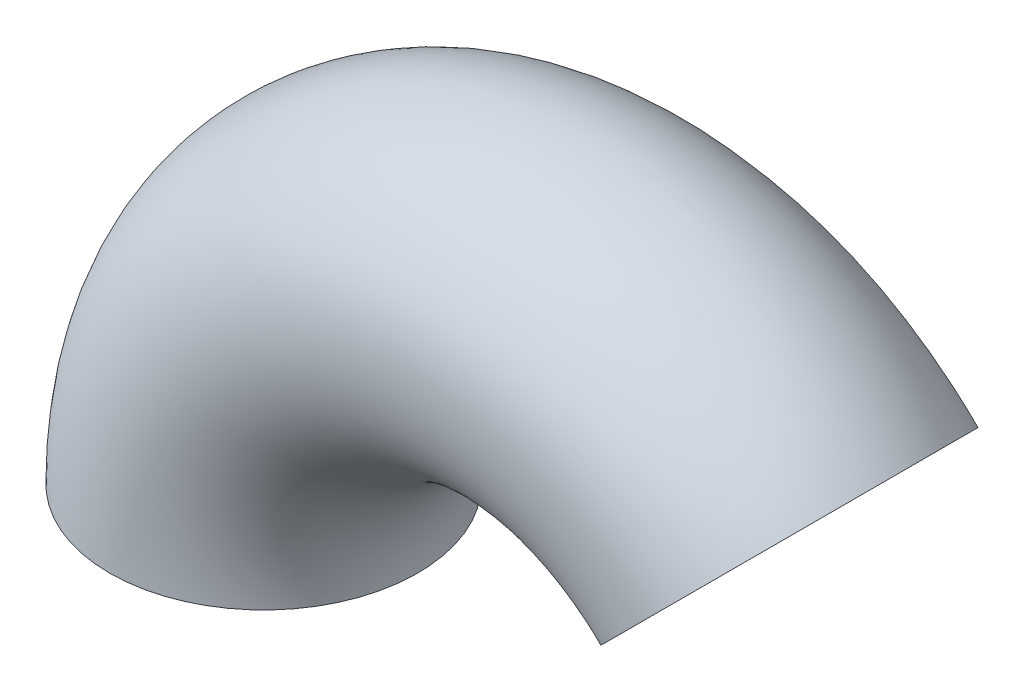
ISO-10303-21;
HEADER;
FILE_DESCRIPTION(('STEP AP214'),'2;1');
FILE_NAME('part.step','',(''),(''),'','','');
FILE_SCHEMA(('AUTOMOTIVE_DESIGN { 1 0 10303 214 1 1 1 1 }'));
ENDSEC;
DATA;
#1=APPLICATION_CONTEXT('core data for automotive mechanical design processes');
#2=APPLICATION_PROTOCOL_DEFINITION('international standard','automotive_design',2000,#1);
#3=PRODUCT_CONTEXT('',#1,'mechanical');
#4=PRODUCT('Part','Part','',(#3));
#5=PRODUCT_RELATED_PRODUCT_CATEGORY('part','',(#4));
#6=PRODUCT_DEFINITION_FORMATION('','',#4);
#7=PRODUCT_DEFINITION_CONTEXT('part definition',#1,'design');
#8=PRODUCT_DEFINITION('design','',#6,#7);
#9=PRODUCT_DEFINITION_SHAPE('','',#8);
#10=(LENGTH_UNIT() NAMED_UNIT(*) SI_UNIT(.MILLI.,.METRE.));
#11=(NAMED_UNIT(*) PLANE_ANGLE_UNIT() SI_UNIT($,.RADIAN.));
#12=(NAMED_UNIT(*) SI_UNIT($,.STERADIAN.) SOLID_ANGLE_UNIT());
#13=UNCERTAINTY_MEASURE_WITH_UNIT(LENGTH_MEASURE(1.E-05),#10,'distance_accuracy_value','');
#14=(GEOMETRIC_REPRESENTATION_CONTEXT(3) GLOBAL_UNCERTAINTY_ASSIGNED_CONTEXT((#13)) GLOBAL_UNIT_ASSIGNED_CONTEXT((#10,
#11,#12)) REPRESENTATION_CONTEXT('',''));
#15=CARTESIAN_POINT('',(0.,0.,0.));
#16=DIRECTION('',(0.,0.,1.));
#17=DIRECTION('',(1.,0.,0.));
#18=AXIS2_PLACEMENT_3D('',#15,#16,#17);
#19=CARTESIAN_POINT('',(0.,0.,0.));
#20=DIRECTION('',(0.,1.,0.));
#21=DIRECTION('',(0.,0.,1.));
#22=AXIS2_PLACEMENT_3D('',#19,#20,#21);
#23=PLANE('',#22);
#24=CARTESIAN_POINT('',(0.,0.,0.));
#25=DIRECTION('',(0.,1.,0.));
#26=DIRECTION('',(0.,0.,1.));
#27=AXIS2_PLACEMENT_3D('',#24,#25,#26);
#28=CIRCLE('',#27,21.209);
#29=CARTESIAN_POINT('',(-21.209,0.,0.));
#30=VERTEX_POINT('',#29);
#31=EDGE_CURVE('E56',#30,#30,#28,.T.);
#32=ORIENTED_EDGE('',*,*,#31,.T.);
#33=EDGE_LOOP('',(#32));
#34=FACE_BOUND('',#33,.T.);
#35=CARTESIAN_POINT('',(0.,0.,0.));
#36=DIRECTION('',(0.,1.,0.));
#37=DIRECTION('',(0.,0.,1.));
#38=AXIS2_PLACEMENT_3D('',#35,#36,#37);
#39=CIRCLE('',#38,23.749);
#40=CARTESIAN_POINT('',(0.,0.,23.749));
#41=VERTEX_POINT('',#40);
#42=EDGE_CURVE('E40',#41,#41,#39,.T.);
#43=ORIENTED_EDGE('',*,*,#42,.F.);
#44=EDGE_LOOP('',(#43));
#45=FACE_BOUND('',#44,.T.);
#46=ADVANCED_FACE('F33',(#34,#45),#23,.F.);
#47=CARTESIAN_POINT('',(81.0841578927988,33.5861578927985,0.));
#48=DIRECTION('',(0.707106781186544,-0.707106781186551,0.));
#49=DIRECTION('',(0.,0.,1.));
#50=AXIS2_PLACEMENT_3D('',#47,#48,#49);
#51=PLANE('',#50);
#52=CARTESIAN_POINT('',(81.0841578927988,33.5861578927985,0.));
#53=DIRECTION('',(0.707106781186544,-0.707106781186551,0.));
#54=DIRECTION('',(0.707106781186551,0.707106781186544,0.));
#55=AXIS2_PLACEMENT_3D('',#52,#53,#54);
#56=CIRCLE('',#55,21.209);
#57=CARTESIAN_POINT('',(96.0811856149844,48.5831856149839,0.));
#58=VERTEX_POINT('',#57);
#59=EDGE_CURVE('E54',#58,#58,#56,.T.);
#60=ORIENTED_EDGE('',*,*,#59,.F.);
#61=EDGE_LOOP('',(#60));
#62=FACE_BOUND('',#61,.T.);
#63=CARTESIAN_POINT('',(81.0841578927988,33.5861578927985,0.));
#64=DIRECTION('',(0.707106781186544,-0.707106781186551,0.));
#65=DIRECTION('',(0.,0.,1.));
#66=AXIS2_PLACEMENT_3D('',#63,#64,#65);
#67=CIRCLE('',#66,23.749);
#68=CARTESIAN_POINT('',(81.0841578927988,33.5861578927985,23.749));
#69=VERTEX_POINT('',#68);
#70=EDGE_CURVE('E11',#69,#69,#67,.T.);
#71=ORIENTED_EDGE('',*,*,#70,.T.);
#72=EDGE_LOOP('',(#71));
#73=FACE_BOUND('',#72,.T.);
#74=ADVANCED_FACE('F47',(#62,#73),#51,.T.);
#75=CARTESIAN_POINT('',(47.498,0.,0.));
#76=DIRECTION('',(0.,0.,-1.));
#77=DIRECTION('',(-1.,0.,0.));
#78=AXIS2_PLACEMENT_3D('',#75,#76,#77);
#79=TOROIDAL_SURFACE('',#78,47.498,23.749);
#80=ORIENTED_EDGE('',*,*,#70,.F.);
#81=EDGE_LOOP('',(#80));
#82=FACE_BOUND('',#81,.T.);
#83=ORIENTED_EDGE('',*,*,#42,.T.);
#84=EDGE_LOOP('',(#83));
#85=FACE_BOUND('',#84,.T.);
#86=ADVANCED_FACE('F49',(#82,#85),#79,.T.);
#87=CARTESIAN_POINT('',(47.498,0.,0.));
#88=DIRECTION('',(0.,0.,-1.));
#89=DIRECTION('',(-1.,0.,0.));
#90=AXIS2_PLACEMENT_3D('',#87,#88,#89);
#91=TOROIDAL_SURFACE('',#90,47.498,21.209);
#92=CARTESIAN_POINT('',(47.498,0.,0.));
#93=DIRECTION('',(0.,0.,-1.));
#94=DIRECTION('',(-1.,0.,0.));
#95=AXIS2_PLACEMENT_3D('',#92,#93,#94);
#96=CIRCLE('',#95,68.707);
#97=EDGE_CURVE('',#30,#58,#96,.T.);
#98=ORIENTED_EDGE('',*,*,#31,.F.);
#99=ORIENTED_EDGE('',*,*,#59,.T.);
#100=ORIENTED_EDGE('',*,*,#97,.T.);
#101=ORIENTED_EDGE('',*,*,#97,.F.);
#102=EDGE_LOOP('',(#98,#100,#99,#101));
#103=FACE_BOUND('',#102,.T.);
#104=ADVANCED_FACE('F52',(#103),#91,.F.);
#105=CLOSED_SHELL('',(#46,#74,#86,#104));
#106=MANIFOLD_SOLID_BREP('B2',#105);
#107=ADVANCED_BREP_SHAPE_REPRESENTATION('',(#18,#106),#14);
#108=SHAPE_DEFINITION_REPRESENTATION(#9,#107);
ENDSEC;
END-ISO-10303-21;
